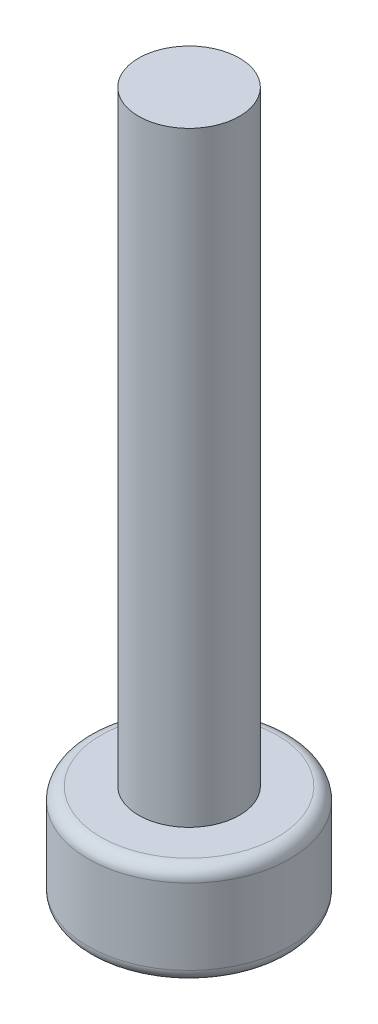
ISO-10303-21;
HEADER;
FILE_DESCRIPTION(('STEP AP214'),'2;1');
FILE_NAME('part.step','',(''),(''),'','','');
FILE_SCHEMA(('AUTOMOTIVE_DESIGN { 1 0 10303 214 1 1 1 1 }'));
ENDSEC;
DATA;
#1=APPLICATION_CONTEXT('core data for automotive mechanical design processes');
#2=APPLICATION_PROTOCOL_DEFINITION('international standard','automotive_design',2000,#1);
#3=PRODUCT_CONTEXT('',#1,'mechanical');
#4=PRODUCT('Part','Part','',(#3));
#5=PRODUCT_RELATED_PRODUCT_CATEGORY('part','',(#4));
#6=PRODUCT_DEFINITION_FORMATION('','',#4);
#7=PRODUCT_DEFINITION_CONTEXT('part definition',#1,'design');
#8=PRODUCT_DEFINITION('design','',#6,#7);
#9=PRODUCT_DEFINITION_SHAPE('','',#8);
#10=(LENGTH_UNIT() NAMED_UNIT(*) SI_UNIT(.MILLI.,.METRE.));
#11=(NAMED_UNIT(*) PLANE_ANGLE_UNIT() SI_UNIT($,.RADIAN.));
#12=(NAMED_UNIT(*) SI_UNIT($,.STERADIAN.) SOLID_ANGLE_UNIT());
#13=UNCERTAINTY_MEASURE_WITH_UNIT(LENGTH_MEASURE(1.E-05),#10,'distance_accuracy_value','');
#14=(GEOMETRIC_REPRESENTATION_CONTEXT(3) GLOBAL_UNCERTAINTY_ASSIGNED_CONTEXT((#13)) GLOBAL_UNIT_ASSIGNED_CONTEXT((#10,
#11,#12)) REPRESENTATION_CONTEXT('',''));
#15=CARTESIAN_POINT('',(0.,0.,0.));
#16=DIRECTION('',(0.,0.,1.));
#17=DIRECTION('',(1.,0.,0.));
#18=AXIS2_PLACEMENT_3D('',#15,#16,#17);
#19=CARTESIAN_POINT('',(0.,12.,0.));
#20=DIRECTION('',(0.,-1.,0.));
#21=DIRECTION('',(0.,0.,-1.));
#22=AXIS2_PLACEMENT_3D('',#19,#20,#21);
#23=CYLINDRICAL_SURFACE('',#22,1.);
#24=CARTESIAN_POINT('',(0.,12.,0.));
#25=DIRECTION('',(0.,1.,0.));
#26=DIRECTION('',(0.,0.,1.));
#27=AXIS2_PLACEMENT_3D('',#24,#25,#26);
#28=CIRCLE('',#27,1.);
#29=CARTESIAN_POINT('',(0.,12.,1.));
#30=VERTEX_POINT('',#29);
#31=EDGE_CURVE('E141',#30,#30,#28,.T.);
#32=ORIENTED_EDGE('',*,*,#31,.F.);
#33=EDGE_LOOP('',(#32));
#34=FACE_BOUND('',#33,.T.);
#35=CARTESIAN_POINT('',(0.,0.,0.));
#36=DIRECTION('',(0.,1.,0.));
#37=DIRECTION('',(0.,0.,1.));
#38=AXIS2_PLACEMENT_3D('',#35,#36,#37);
#39=CIRCLE('',#38,1.);
#40=CARTESIAN_POINT('',(0.,0.,1.));
#41=VERTEX_POINT('',#40);
#42=EDGE_CURVE('E135',#41,#41,#39,.T.);
#43=ORIENTED_EDGE('',*,*,#42,.T.);
#44=EDGE_LOOP('',(#43));
#45=FACE_BOUND('',#44,.T.);
#46=ADVANCED_FACE('F33',(#34,#45),#23,.T.);
#47=CARTESIAN_POINT('',(0.,12.,0.));
#48=DIRECTION('',(0.,1.,0.));
#49=DIRECTION('',(0.,0.,1.));
#50=AXIS2_PLACEMENT_3D('',#47,#48,#49);
#51=PLANE('',#50);
#52=ORIENTED_EDGE('',*,*,#31,.T.);
#53=EDGE_LOOP('',(#52));
#54=FACE_BOUND('',#53,.T.);
#55=ADVANCED_FACE('F171',(#54),#51,.T.);
#56=CARTESIAN_POINT('',(0.,-2.,0.));
#57=DIRECTION('',(0.,1.,0.));
#58=DIRECTION('',(0.,0.,1.));
#59=AXIS2_PLACEMENT_3D('',#56,#57,#58);
#60=CYLINDRICAL_SURFACE('',#59,2.);
#61=CARTESIAN_POINT('',(0.,-0.25,0.));
#62=DIRECTION('',(0.,1.,0.));
#63=DIRECTION('',(0.,0.,1.));
#64=AXIS2_PLACEMENT_3D('',#61,#62,#63);
#65=CIRCLE('',#64,2.);
#66=CARTESIAN_POINT('',(0.,-0.25,2.));
#67=VERTEX_POINT('',#66);
#68=EDGE_CURVE('E41',#67,#67,#65,.F.);
#69=ORIENTED_EDGE('',*,*,#68,.T.);
#70=EDGE_LOOP('',(#69));
#71=FACE_BOUND('',#70,.T.);
#72=CARTESIAN_POINT('',(0.,-1.75,0.));
#73=DIRECTION('',(0.,1.,0.));
#74=DIRECTION('',(0.,0.,1.));
#75=AXIS2_PLACEMENT_3D('',#72,#73,#74);
#76=CIRCLE('',#75,2.);
#77=CARTESIAN_POINT('',(0.,-1.75,2.));
#78=VERTEX_POINT('',#77);
#79=EDGE_CURVE('E149',#78,#78,#76,.T.);
#80=ORIENTED_EDGE('',*,*,#79,.T.);
#81=EDGE_LOOP('',(#80));
#82=FACE_BOUND('',#81,.T.);
#83=ADVANCED_FACE('F154',(#71,#82),#60,.T.);
#84=CARTESIAN_POINT('',(0.,-2.,0.));
#85=DIRECTION('',(0.,1.,0.));
#86=DIRECTION('',(0.,0.,1.));
#87=AXIS2_PLACEMENT_3D('',#84,#85,#86);
#88=PLANE('',#87);
#89=CARTESIAN_POINT('',(0.,-2.,0.));
#90=DIRECTION('',(0.,1.,0.));
#91=DIRECTION('',(0.,0.,1.));
#92=AXIS2_PLACEMENT_3D('',#89,#90,#91);
#93=CIRCLE('',#92,1.75);
#94=CARTESIAN_POINT('',(0.,-2.,1.75));
#95=VERTEX_POINT('',#94);
#96=EDGE_CURVE('E11',#95,#95,#93,.F.);
#97=ORIENTED_EDGE('',*,*,#96,.T.);
#98=EDGE_LOOP('',(#97));
#99=FACE_BOUND('',#98,.T.);
#100=DIRECTION('',(-0.866025403784439,0.,-0.5));
#101=VECTOR('',#100,1.);
#102=CARTESIAN_POINT('',(0.,-2.,0.866025403784439));
#103=LINE('',#102,#101);
#104=CARTESIAN_POINT('',(0.,-2.,0.866025403784439));
#105=VERTEX_POINT('',#104);
#106=CARTESIAN_POINT('',(-0.75,-2.,0.43301270189222));
#107=VERTEX_POINT('',#106);
#108=EDGE_CURVE('E122',#105,#107,#103,.T.);
#109=ORIENTED_EDGE('',*,*,#108,.F.);
#110=DIRECTION('',(-0.866025403784439,0.,0.5));
#111=VECTOR('',#110,1.);
#112=CARTESIAN_POINT('',(0.75,-2.,0.433012701892219));
#113=LINE('',#112,#111);
#114=CARTESIAN_POINT('',(0.75,-2.,0.433012701892219));
#115=VERTEX_POINT('',#114);
#116=EDGE_CURVE('E48',#115,#105,#113,.T.);
#117=ORIENTED_EDGE('',*,*,#116,.F.);
#118=DIRECTION('',(0.,0.,1.));
#119=VECTOR('',#118,1.);
#120=CARTESIAN_POINT('',(0.75,-2.,-0.433012701892219));
#121=LINE('',#120,#119);
#122=CARTESIAN_POINT('',(0.75,-2.,-0.433012701892219));
#123=VERTEX_POINT('',#122);
#124=EDGE_CURVE('E131',#123,#115,#121,.T.);
#125=ORIENTED_EDGE('',*,*,#124,.F.);
#126=DIRECTION('',(0.866025403784439,0.,0.5));
#127=VECTOR('',#126,1.);
#128=CARTESIAN_POINT('',(0.,-2.,-0.866025403784439));
#129=LINE('',#128,#127);
#130=CARTESIAN_POINT('',(0.,-2.,-0.866025403784439));
#131=VERTEX_POINT('',#130);
#132=EDGE_CURVE('E129',#131,#123,#129,.T.);
#133=ORIENTED_EDGE('',*,*,#132,.F.);
#134=DIRECTION('',(0.866025403784438,0.,-0.5));
#135=VECTOR('',#134,1.);
#136=CARTESIAN_POINT('',(-0.75,-2.,-0.433012701892219));
#137=LINE('',#136,#135);
#138=CARTESIAN_POINT('',(-0.75,-2.,-0.433012701892219));
#139=VERTEX_POINT('',#138);
#140=EDGE_CURVE('E96',#139,#131,#137,.T.);
#141=ORIENTED_EDGE('',*,*,#140,.F.);
#142=DIRECTION('',(0.,0.,-1.));
#143=VECTOR('',#142,1.);
#144=CARTESIAN_POINT('',(-0.75,-2.,0.43301270189222));
#145=LINE('',#144,#143);
#146=EDGE_CURVE('E125',#107,#139,#145,.T.);
#147=ORIENTED_EDGE('',*,*,#146,.F.);
#148=EDGE_LOOP('',(#109,#117,#125,#133,#141,#147));
#149=FACE_BOUND('',#148,.T.);
#150=ADVANCED_FACE('F166',(#99,#149),#88,.F.);
#151=CARTESIAN_POINT('',(0.,0.,0.));
#152=DIRECTION('',(0.,1.,0.));
#153=DIRECTION('',(0.,0.,1.));
#154=AXIS2_PLACEMENT_3D('',#151,#152,#153);
#155=PLANE('',#154);
#156=CARTESIAN_POINT('',(0.,0.,0.));
#157=DIRECTION('',(0.,1.,0.));
#158=DIRECTION('',(0.,0.,1.));
#159=AXIS2_PLACEMENT_3D('',#156,#157,#158);
#160=CIRCLE('',#159,1.75);
#161=CARTESIAN_POINT('',(0.,0.,1.75));
#162=VERTEX_POINT('',#161);
#163=EDGE_CURVE('E144',#162,#162,#160,.T.);
#164=ORIENTED_EDGE('',*,*,#163,.T.);
#165=EDGE_LOOP('',(#164));
#166=FACE_BOUND('',#165,.T.);
#167=ORIENTED_EDGE('',*,*,#42,.F.);
#168=EDGE_LOOP('',(#167));
#169=FACE_BOUND('',#168,.T.);
#170=ADVANCED_FACE('F162',(#166,#169),#155,.T.);
#171=CARTESIAN_POINT('',(0.75,0.,0.433012701892219));
#172=DIRECTION('',(0.5,0.,0.866025403784439));
#173=DIRECTION('',(0.866025403784439,0.,-0.5));
#174=AXIS2_PLACEMENT_3D('',#171,#172,#173);
#175=PLANE('',#174);
#176=ORIENTED_EDGE('',*,*,#116,.T.);
#177=DIRECTION('',(0.,-1.,0.));
#178=VECTOR('',#177,1.);
#179=CARTESIAN_POINT('',(0.,0.,0.866025403784439));
#180=LINE('',#179,#178);
#181=CARTESIAN_POINT('',(0.,0.,0.866025403784439));
#182=VERTEX_POINT('',#181);
#183=EDGE_CURVE('E78',#182,#105,#180,.T.);
#184=ORIENTED_EDGE('',*,*,#183,.F.);
#185=DIRECTION('',(-0.866025403784439,0.,0.5));
#186=VECTOR('',#185,1.);
#187=CARTESIAN_POINT('',(0.75,0.,0.433012701892219));
#188=LINE('',#187,#186);
#189=CARTESIAN_POINT('',(0.75,0.,0.433012701892219));
#190=VERTEX_POINT('',#189);
#191=EDGE_CURVE('E133',#190,#182,#188,.T.);
#192=ORIENTED_EDGE('',*,*,#191,.F.);
#193=DIRECTION('',(0.,-1.,0.));
#194=VECTOR('',#193,1.);
#195=CARTESIAN_POINT('',(0.75,0.,0.433012701892219));
#196=LINE('',#195,#194);
#197=EDGE_CURVE('E56',#190,#115,#196,.T.);
#198=ORIENTED_EDGE('',*,*,#197,.T.);
#199=EDGE_LOOP('',(#176,#184,#192,#198));
#200=FACE_BOUND('',#199,.T.);
#201=ADVANCED_FACE('F165',(#200),#175,.F.);
#202=CARTESIAN_POINT('',(0.75,0.,-0.433012701892219));
#203=DIRECTION('',(1.,0.,0.));
#204=DIRECTION('',(0.,0.,-1.));
#205=AXIS2_PLACEMENT_3D('',#202,#203,#204);
#206=PLANE('',#205);
#207=ORIENTED_EDGE('',*,*,#124,.T.);
#208=ORIENTED_EDGE('',*,*,#197,.F.);
#209=DIRECTION('',(0.,0.,1.));
#210=VECTOR('',#209,1.);
#211=CARTESIAN_POINT('',(0.75,0.,-0.433012701892219));
#212=LINE('',#211,#210);
#213=CARTESIAN_POINT('',(0.75,0.,-0.433012701892219));
#214=VERTEX_POINT('',#213);
#215=EDGE_CURVE('E108',#214,#190,#212,.T.);
#216=ORIENTED_EDGE('',*,*,#215,.F.);
#217=DIRECTION('',(0.,-1.,0.));
#218=VECTOR('',#217,1.);
#219=CARTESIAN_POINT('',(0.75,0.,-0.433012701892219));
#220=LINE('',#219,#218);
#221=EDGE_CURVE('E100',#214,#123,#220,.T.);
#222=ORIENTED_EDGE('',*,*,#221,.T.);
#223=EDGE_LOOP('',(#207,#208,#216,#222));
#224=FACE_BOUND('',#223,.T.);
#225=ADVANCED_FACE('F188',(#224),#206,.F.);
#226=CARTESIAN_POINT('',(0.,0.,-0.866025403784439));
#227=DIRECTION('',(0.5,0.,-0.866025403784439));
#228=DIRECTION('',(-0.866025403784439,0.,-0.5));
#229=AXIS2_PLACEMENT_3D('',#226,#227,#228);
#230=PLANE('',#229);
#231=ORIENTED_EDGE('',*,*,#132,.T.);
#232=ORIENTED_EDGE('',*,*,#221,.F.);
#233=DIRECTION('',(0.866025403784439,0.,0.5));
#234=VECTOR('',#233,1.);
#235=CARTESIAN_POINT('',(0.,0.,-0.866025403784439));
#236=LINE('',#235,#234);
#237=CARTESIAN_POINT('',(0.,0.,-0.866025403784439));
#238=VERTEX_POINT('',#237);
#239=EDGE_CURVE('E104',#238,#214,#236,.T.);
#240=ORIENTED_EDGE('',*,*,#239,.F.);
#241=DIRECTION('',(0.,-1.,0.));
#242=VECTOR('',#241,1.);
#243=CARTESIAN_POINT('',(0.,0.,-0.866025403784439));
#244=LINE('',#243,#242);
#245=EDGE_CURVE('E89',#238,#131,#244,.T.);
#246=ORIENTED_EDGE('',*,*,#245,.T.);
#247=EDGE_LOOP('',(#231,#232,#240,#246));
#248=FACE_BOUND('',#247,.T.);
#249=ADVANCED_FACE('F105',(#248),#230,.F.);
#250=CARTESIAN_POINT('',(-0.75,0.,-0.433012701892219));
#251=DIRECTION('',(-0.5,0.,-0.866025403784439));
#252=DIRECTION('',(-0.866025403784438,0.,0.5));
#253=AXIS2_PLACEMENT_3D('',#250,#251,#252);
#254=PLANE('',#253);
#255=ORIENTED_EDGE('',*,*,#140,.T.);
#256=ORIENTED_EDGE('',*,*,#245,.F.);
#257=DIRECTION('',(0.866025403784438,0.,-0.5));
#258=VECTOR('',#257,1.);
#259=CARTESIAN_POINT('',(-0.75,0.,-0.433012701892219));
#260=LINE('',#259,#258);
#261=CARTESIAN_POINT('',(-0.75,0.,-0.433012701892219));
#262=VERTEX_POINT('',#261);
#263=EDGE_CURVE('E93',#262,#238,#260,.T.);
#264=ORIENTED_EDGE('',*,*,#263,.F.);
#265=DIRECTION('',(0.,-1.,0.));
#266=VECTOR('',#265,1.);
#267=CARTESIAN_POINT('',(-0.75,0.,-0.433012701892219));
#268=LINE('',#267,#266);
#269=EDGE_CURVE('E101',#262,#139,#268,.T.);
#270=ORIENTED_EDGE('',*,*,#269,.T.);
#271=EDGE_LOOP('',(#255,#256,#264,#270));
#272=FACE_BOUND('',#271,.T.);
#273=ADVANCED_FACE('F91',(#272),#254,.F.);
#274=CARTESIAN_POINT('',(-0.75,0.,0.43301270189222));
#275=DIRECTION('',(-1.,0.,0.));
#276=DIRECTION('',(0.,0.,1.));
#277=AXIS2_PLACEMENT_3D('',#274,#275,#276);
#278=PLANE('',#277);
#279=ORIENTED_EDGE('',*,*,#146,.T.);
#280=ORIENTED_EDGE('',*,*,#269,.F.);
#281=DIRECTION('',(0.,0.,-1.));
#282=VECTOR('',#281,1.);
#283=CARTESIAN_POINT('',(-0.75,0.,0.43301270189222));
#284=LINE('',#283,#282);
#285=CARTESIAN_POINT('',(-0.75,0.,0.43301270189222));
#286=VERTEX_POINT('',#285);
#287=EDGE_CURVE('E114',#286,#262,#284,.T.);
#288=ORIENTED_EDGE('',*,*,#287,.F.);
#289=DIRECTION('',(0.,-1.,0.));
#290=VECTOR('',#289,1.);
#291=CARTESIAN_POINT('',(-0.75,0.,0.43301270189222));
#292=LINE('',#291,#290);
#293=EDGE_CURVE('E138',#286,#107,#292,.T.);
#294=ORIENTED_EDGE('',*,*,#293,.T.);
#295=EDGE_LOOP('',(#279,#280,#288,#294));
#296=FACE_BOUND('',#295,.T.);
#297=ADVANCED_FACE('F192',(#296),#278,.F.);
#298=CARTESIAN_POINT('',(0.,0.,0.866025403784439));
#299=DIRECTION('',(-0.5,0.,0.866025403784439));
#300=DIRECTION('',(0.866025403784439,0.,0.5));
#301=AXIS2_PLACEMENT_3D('',#298,#299,#300);
#302=PLANE('',#301);
#303=ORIENTED_EDGE('',*,*,#108,.T.);
#304=ORIENTED_EDGE('',*,*,#293,.F.);
#305=DIRECTION('',(-0.866025403784439,0.,-0.5));
#306=VECTOR('',#305,1.);
#307=CARTESIAN_POINT('',(0.,0.,0.866025403784439));
#308=LINE('',#307,#306);
#309=EDGE_CURVE('E116',#182,#286,#308,.T.);
#310=ORIENTED_EDGE('',*,*,#309,.F.);
#311=ORIENTED_EDGE('',*,*,#183,.T.);
#312=EDGE_LOOP('',(#303,#304,#310,#311));
#313=FACE_BOUND('',#312,.T.);
#314=ADVANCED_FACE('F189',(#313),#302,.F.);
#315=CARTESIAN_POINT('',(0.,0.,0.));
#316=DIRECTION('',(0.,-1.,0.));
#317=DIRECTION('',(0.,0.,-1.));
#318=AXIS2_PLACEMENT_3D('',#315,#316,#317);
#319=PLANE('',#318);
#320=ORIENTED_EDGE('',*,*,#191,.T.);
#321=ORIENTED_EDGE('',*,*,#309,.T.);
#322=ORIENTED_EDGE('',*,*,#287,.T.);
#323=ORIENTED_EDGE('',*,*,#263,.T.);
#324=ORIENTED_EDGE('',*,*,#239,.T.);
#325=ORIENTED_EDGE('',*,*,#215,.T.);
#326=EDGE_LOOP('',(#320,#321,#322,#323,#324,#325));
#327=FACE_BOUND('',#326,.T.);
#328=ADVANCED_FACE('F111',(#327),#319,.T.);
#329=CARTESIAN_POINT('',(0.,-0.25,0.));
#330=DIRECTION('',(0.,1.,0.));
#331=DIRECTION('',(0.,0.,1.));
#332=AXIS2_PLACEMENT_3D('',#329,#330,#331);
#333=TOROIDAL_SURFACE('',#332,1.75,0.25);
#334=ORIENTED_EDGE('',*,*,#68,.F.);
#335=EDGE_LOOP('',(#334));
#336=FACE_BOUND('',#335,.T.);
#337=ORIENTED_EDGE('',*,*,#163,.F.);
#338=EDGE_LOOP('',(#337));
#339=FACE_BOUND('',#338,.T.);
#340=ADVANCED_FACE('F157',(#336,#339),#333,.T.);
#341=CARTESIAN_POINT('',(0.,-1.75,0.));
#342=DIRECTION('',(0.,1.,0.));
#343=DIRECTION('',(0.,0.,1.));
#344=AXIS2_PLACEMENT_3D('',#341,#342,#343);
#345=TOROIDAL_SURFACE('',#344,1.75,0.25);
#346=ORIENTED_EDGE('',*,*,#96,.F.);
#347=EDGE_LOOP('',(#346));
#348=FACE_BOUND('',#347,.T.);
#349=ORIENTED_EDGE('',*,*,#79,.F.);
#350=EDGE_LOOP('',(#349));
#351=FACE_BOUND('',#350,.T.);
#352=ADVANCED_FACE('F35',(#348,#351),#345,.T.);
#353=CLOSED_SHELL('',(#46,#55,#83,#150,#170,#201,#225,#249,#273,#297,#314,#328,#340,#352));
#354=MANIFOLD_SOLID_BREP('B2',#353);
#355=ADVANCED_BREP_SHAPE_REPRESENTATION('',(#18,#354),#14);
#356=SHAPE_DEFINITION_REPRESENTATION(#9,#355);
ENDSEC;
END-ISO-10303-21;
